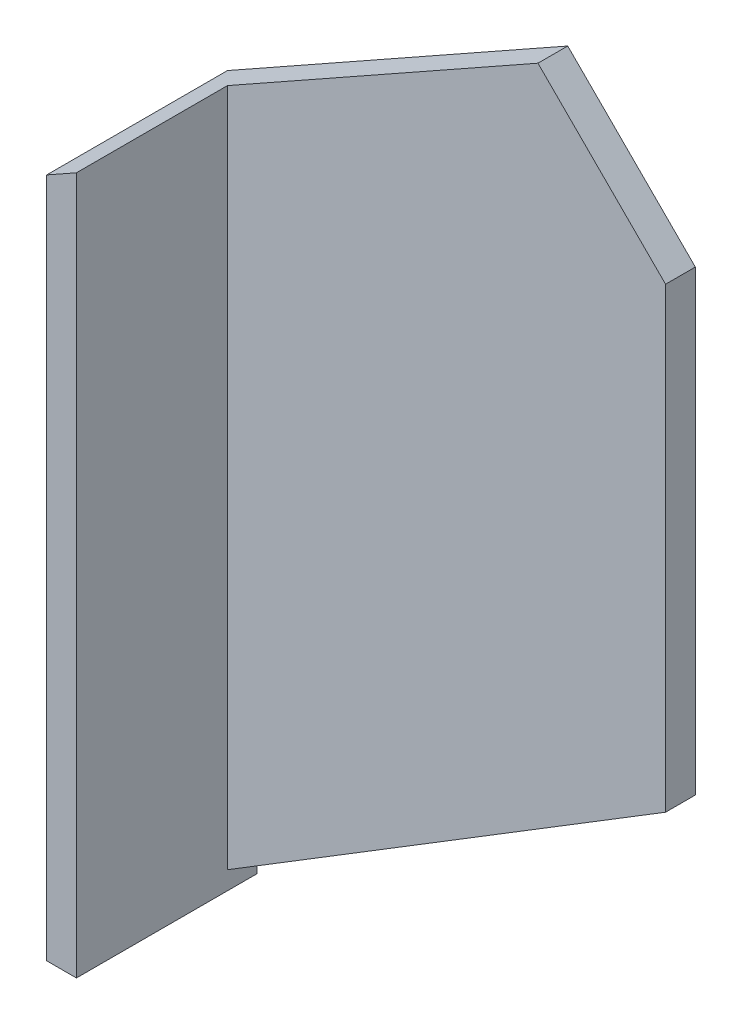
ISO-10303-21;
HEADER;
FILE_DESCRIPTION(('STEP AP214'),'2;1');
FILE_NAME('part.step','',(''),(''),'','','');
FILE_SCHEMA(('AUTOMOTIVE_DESIGN { 1 0 10303 214 1 1 1 1 }'));
ENDSEC;
DATA;
#1=APPLICATION_CONTEXT('core data for automotive mechanical design processes');
#2=APPLICATION_PROTOCOL_DEFINITION('international standard','automotive_design',2000,#1);
#3=PRODUCT_CONTEXT('',#1,'mechanical');
#4=PRODUCT('Part','Part','',(#3));
#5=PRODUCT_RELATED_PRODUCT_CATEGORY('part','',(#4));
#6=PRODUCT_DEFINITION_FORMATION('','',#4);
#7=PRODUCT_DEFINITION_CONTEXT('part definition',#1,'design');
#8=PRODUCT_DEFINITION('design','',#6,#7);
#9=PRODUCT_DEFINITION_SHAPE('','',#8);
#10=(LENGTH_UNIT() NAMED_UNIT(*) SI_UNIT(.MILLI.,.METRE.));
#11=(NAMED_UNIT(*) PLANE_ANGLE_UNIT() SI_UNIT($,.RADIAN.));
#12=(NAMED_UNIT(*) SI_UNIT($,.STERADIAN.) SOLID_ANGLE_UNIT());
#13=UNCERTAINTY_MEASURE_WITH_UNIT(LENGTH_MEASURE(1.E-05),#10,'distance_accuracy_value','');
#14=(GEOMETRIC_REPRESENTATION_CONTEXT(3) GLOBAL_UNCERTAINTY_ASSIGNED_CONTEXT((#13)) GLOBAL_UNIT_ASSIGNED_CONTEXT((#10,
#11,#12)) REPRESENTATION_CONTEXT('',''));
#15=CARTESIAN_POINT('',(0.,0.,0.));
#16=DIRECTION('',(0.,0.,1.));
#17=DIRECTION('',(1.,0.,0.));
#18=AXIS2_PLACEMENT_3D('',#15,#16,#17);
#19=CARTESIAN_POINT('',(-119.656440363729,-63.3766663723846,14.));
#20=DIRECTION('',(-0.52301621985259,0.852322728648666,0.));
#21=DIRECTION('',(-0.852322728648666,-0.52301621985259,0.));
#22=AXIS2_PLACEMENT_3D('',#19,#20,#21);
#23=PLANE('',#22);
#24=DIRECTION('',(0.,0.,1.));
#25=VECTOR('',#24,1.);
#26=CARTESIAN_POINT('',(-105.656440363729,-54.7857572814755,14.));
#27=LINE('',#26,#25);
#28=CARTESIAN_POINT('',(-105.656440363729,-54.7857572814755,0.));
#29=VERTEX_POINT('',#28);
#30=CARTESIAN_POINT('',(-105.656440363729,-54.7857572814754,14.));
#31=VERTEX_POINT('',#30);
#32=EDGE_CURVE('E50',#29,#31,#27,.T.);
#33=ORIENTED_EDGE('',*,*,#32,.F.);
#34=DIRECTION('',(0.852322728648666,0.52301621985259,0.));
#35=VECTOR('',#34,1.);
#36=CARTESIAN_POINT('',(-119.656440363729,-63.3766663723846,0.));
#37=LINE('',#36,#35);
#38=CARTESIAN_POINT('',(100.343559636271,71.6233336276154,0.));
#39=VERTEX_POINT('',#38);
#40=EDGE_CURVE('E106',#29,#39,#37,.T.);
#41=ORIENTED_EDGE('',*,*,#40,.T.);
#42=DIRECTION('',(0.,0.,-1.));
#43=VECTOR('',#42,1.);
#44=CARTESIAN_POINT('',(100.343559636271,71.6233336276154,14.));
#45=LINE('',#44,#43);
#46=CARTESIAN_POINT('',(100.343559636271,71.6233336276154,14.));
#47=VERTEX_POINT('',#46);
#48=EDGE_CURVE('E11',#47,#39,#45,.T.);
#49=ORIENTED_EDGE('',*,*,#48,.F.);
#50=DIRECTION('',(0.852322728648666,0.52301621985259,0.));
#51=VECTOR('',#50,1.);
#52=CARTESIAN_POINT('',(-119.656440363729,-63.3766663723846,14.));
#53=LINE('',#52,#51);
#54=EDGE_CURVE('E164',#31,#47,#53,.T.);
#55=ORIENTED_EDGE('',*,*,#54,.F.);
#56=EDGE_LOOP('',(#33,#41,#49,#55));
#57=FACE_BOUND('',#56,.T.);
#58=ADVANCED_FACE('F34',(#57),#23,.F.);
#59=CARTESIAN_POINT('',(233.582996255987,153.383897007896,14.));
#60=DIRECTION('',(0.,0.,1.));
#61=DIRECTION('',(1.,0.,0.));
#62=AXIS2_PLACEMENT_3D('',#59,#60,#61);
#63=PLANE('',#62);
#64=DIRECTION('',(0.,1.,0.));
#65=VECTOR('',#64,1.);
#66=CARTESIAN_POINT('',(-105.656440363729,264.498333627615,14.));
#67=LINE('',#66,#65);
#68=CARTESIAN_POINT('',(-105.656440363729,264.498333627615,14.));
#69=VERTEX_POINT('',#68);
#70=EDGE_CURVE('E58',#31,#69,#67,.T.);
#71=ORIENTED_EDGE('',*,*,#70,.F.);
#72=ORIENTED_EDGE('',*,*,#54,.T.);
#73=DIRECTION('',(0.,1.,0.));
#74=VECTOR('',#73,1.);
#75=CARTESIAN_POINT('',(100.343559636271,71.6233336276154,14.));
#76=LINE('',#75,#74);
#77=CARTESIAN_POINT('',(100.343559636271,286.623333627615,14.));
#78=VERTEX_POINT('',#77);
#79=EDGE_CURVE('E172',#47,#78,#76,.T.);
#80=ORIENTED_EDGE('',*,*,#79,.T.);
#81=DIRECTION('',(-0.70710678118654,0.707106781186555,0.));
#82=VECTOR('',#81,1.);
#83=CARTESIAN_POINT('',(100.343559636271,286.623333627615,14.));
#84=LINE('',#83,#82);
#85=CARTESIAN_POINT('',(40.3435596362774,346.62333362761,14.));
#86=VERTEX_POINT('',#85);
#87=EDGE_CURVE('E174',#78,#86,#84,.T.);
#88=ORIENTED_EDGE('',*,*,#87,.T.);
#89=DIRECTION('',(-0.87157553712457,-0.490261239632521,0.));
#90=VECTOR('',#89,1.);
#91=CARTESIAN_POINT('',(40.3435596362774,346.62333362761,14.));
#92=LINE('',#91,#90);
#93=EDGE_CURVE('E143',#86,#69,#92,.T.);
#94=ORIENTED_EDGE('',*,*,#93,.T.);
#95=EDGE_LOOP('',(#71,#72,#80,#88,#94));
#96=FACE_BOUND('',#95,.T.);
#97=ADVANCED_FACE('F178',(#96),#63,.T.);
#98=CARTESIAN_POINT('',(233.582996255987,153.383897007896,0.));
#99=DIRECTION('',(0.,0.,1.));
#100=DIRECTION('',(1.,0.,0.));
#101=AXIS2_PLACEMENT_3D('',#98,#99,#100);
#102=PLANE('',#101);
#103=DIRECTION('',(-1.,0.,0.));
#104=VECTOR('',#103,1.);
#105=CARTESIAN_POINT('',(-105.656440363729,-63.3766663723846,0.));
#106=LINE('',#105,#104);
#107=CARTESIAN_POINT('',(-105.656440363729,-63.3766663723846,0.));
#108=VERTEX_POINT('',#107);
#109=CARTESIAN_POINT('',(-119.656440363729,-63.3766663723846,0.));
#110=VERTEX_POINT('',#109);
#111=EDGE_CURVE('E104',#108,#110,#106,.T.);
#112=ORIENTED_EDGE('',*,*,#111,.T.);
#113=DIRECTION('',(0.,-1.,0.));
#114=VECTOR('',#113,1.);
#115=CARTESIAN_POINT('',(-119.656440363729,-63.3766663723846,0.));
#116=LINE('',#115,#114);
#117=CARTESIAN_POINT('',(-119.656440363729,256.623333627615,0.));
#118=VERTEX_POINT('',#117);
#119=EDGE_CURVE('E162',#118,#110,#116,.T.);
#120=ORIENTED_EDGE('',*,*,#119,.F.);
#121=DIRECTION('',(-0.87157553712457,-0.490261239632521,0.));
#122=VECTOR('',#121,1.);
#123=CARTESIAN_POINT('',(40.3435596362774,346.62333362761,0.));
#124=LINE('',#123,#122);
#125=CARTESIAN_POINT('',(40.3435596362774,346.62333362761,0.));
#126=VERTEX_POINT('',#125);
#127=EDGE_CURVE('E159',#126,#118,#124,.T.);
#128=ORIENTED_EDGE('',*,*,#127,.F.);
#129=DIRECTION('',(-0.70710678118654,0.707106781186555,0.));
#130=VECTOR('',#129,1.);
#131=CARTESIAN_POINT('',(100.343559636271,286.623333627615,0.));
#132=LINE('',#131,#130);
#133=CARTESIAN_POINT('',(100.343559636271,286.623333627615,0.));
#134=VERTEX_POINT('',#133);
#135=EDGE_CURVE('E153',#134,#126,#132,.T.);
#136=ORIENTED_EDGE('',*,*,#135,.F.);
#137=DIRECTION('',(0.,1.,0.));
#138=VECTOR('',#137,1.);
#139=CARTESIAN_POINT('',(100.343559636271,71.6233336276154,0.));
#140=LINE('',#139,#138);
#141=EDGE_CURVE('E150',#39,#134,#140,.T.);
#142=ORIENTED_EDGE('',*,*,#141,.F.);
#143=ORIENTED_EDGE('',*,*,#40,.F.);
#144=DIRECTION('',(0.,-1.,0.));
#145=VECTOR('',#144,1.);
#146=CARTESIAN_POINT('',(-105.656440363729,256.623333627615,0.));
#147=LINE('',#146,#145);
#148=EDGE_CURVE('E100',#29,#108,#147,.T.);
#149=ORIENTED_EDGE('',*,*,#148,.T.);
#150=EDGE_LOOP('',(#112,#120,#128,#136,#142,#143,#149));
#151=FACE_BOUND('',#150,.T.);
#152=ADVANCED_FACE('F102',(#151),#102,.F.);
#153=CARTESIAN_POINT('',(100.343559636271,71.6233336276154,14.));
#154=DIRECTION('',(-1.,0.,0.));
#155=DIRECTION('',(0.,0.,1.));
#156=AXIS2_PLACEMENT_3D('',#153,#154,#155);
#157=PLANE('',#156);
#158=ORIENTED_EDGE('',*,*,#141,.T.);
#159=DIRECTION('',(0.,0.,-1.));
#160=VECTOR('',#159,1.);
#161=CARTESIAN_POINT('',(100.343559636271,286.623333627615,14.));
#162=LINE('',#161,#160);
#163=EDGE_CURVE('E42',#78,#134,#162,.T.);
#164=ORIENTED_EDGE('',*,*,#163,.F.);
#165=ORIENTED_EDGE('',*,*,#79,.F.);
#166=ORIENTED_EDGE('',*,*,#48,.T.);
#167=EDGE_LOOP('',(#158,#164,#165,#166));
#168=FACE_BOUND('',#167,.T.);
#169=ADVANCED_FACE('F204',(#168),#157,.F.);
#170=CARTESIAN_POINT('',(100.343559636271,286.623333627615,14.));
#171=DIRECTION('',(-0.707106781186555,-0.70710678118654,0.));
#172=DIRECTION('',(0.70710678118654,-0.707106781186555,0.));
#173=AXIS2_PLACEMENT_3D('',#170,#171,#172);
#174=PLANE('',#173);
#175=ORIENTED_EDGE('',*,*,#135,.T.);
#176=DIRECTION('',(0.,0.,-1.));
#177=VECTOR('',#176,1.);
#178=CARTESIAN_POINT('',(40.3435596362774,346.62333362761,14.));
#179=LINE('',#178,#177);
#180=EDGE_CURVE('E168',#86,#126,#179,.T.);
#181=ORIENTED_EDGE('',*,*,#180,.F.);
#182=ORIENTED_EDGE('',*,*,#87,.F.);
#183=ORIENTED_EDGE('',*,*,#163,.T.);
#184=EDGE_LOOP('',(#175,#181,#182,#183));
#185=FACE_BOUND('',#184,.T.);
#186=ADVANCED_FACE('F211',(#185),#174,.F.);
#187=CARTESIAN_POINT('',(40.3435596362774,346.62333362761,14.));
#188=DIRECTION('',(0.490261239632521,-0.87157553712457,0.));
#189=DIRECTION('',(0.87157553712457,0.490261239632521,0.));
#190=AXIS2_PLACEMENT_3D('',#187,#188,#189);
#191=PLANE('',#190);
#192=ORIENTED_EDGE('',*,*,#127,.T.);
#193=DIRECTION('',(0.,0.,-1.));
#194=VECTOR('',#193,1.);
#195=CARTESIAN_POINT('',(-119.656440363729,256.623333627615,14.));
#196=LINE('',#195,#194);
#197=CARTESIAN_POINT('',(-119.656440363729,256.623333627615,85.));
#198=VERTEX_POINT('',#197);
#199=EDGE_CURVE('E166',#198,#118,#196,.T.);
#200=ORIENTED_EDGE('',*,*,#199,.F.);
#201=DIRECTION('',(-0.871575537124571,-0.490261239632521,0.));
#202=VECTOR('',#201,1.);
#203=CARTESIAN_POINT('',(-105.656440363729,264.498333627615,85.));
#204=LINE('',#203,#202);
#205=CARTESIAN_POINT('',(-105.656440363729,264.498333627615,85.));
#206=VERTEX_POINT('',#205);
#207=EDGE_CURVE('E129',#206,#198,#204,.T.);
#208=ORIENTED_EDGE('',*,*,#207,.F.);
#209=DIRECTION('',(0.,0.,-1.));
#210=VECTOR('',#209,1.);
#211=CARTESIAN_POINT('',(-105.656440363729,264.498333627615,85.));
#212=LINE('',#211,#210);
#213=EDGE_CURVE('E136',#206,#69,#212,.T.);
#214=ORIENTED_EDGE('',*,*,#213,.T.);
#215=ORIENTED_EDGE('',*,*,#93,.F.);
#216=ORIENTED_EDGE('',*,*,#180,.T.);
#217=EDGE_LOOP('',(#192,#200,#208,#214,#215,#216));
#218=FACE_BOUND('',#217,.T.);
#219=ADVANCED_FACE('F179',(#218),#191,.F.);
#220=CARTESIAN_POINT('',(-119.656440363729,-63.3766663723846,14.));
#221=DIRECTION('',(1.,0.,0.));
#222=DIRECTION('',(0.,1.,0.));
#223=AXIS2_PLACEMENT_3D('',#220,#221,#222);
#224=PLANE('',#223);
#225=ORIENTED_EDGE('',*,*,#119,.T.);
#226=DIRECTION('',(0.,0.,-1.));
#227=VECTOR('',#226,1.);
#228=CARTESIAN_POINT('',(-119.656440363729,-63.3766663723846,14.));
#229=LINE('',#228,#227);
#230=CARTESIAN_POINT('',(-119.656440363729,-63.3766663723846,85.));
#231=VERTEX_POINT('',#230);
#232=EDGE_CURVE('E115',#231,#110,#229,.T.);
#233=ORIENTED_EDGE('',*,*,#232,.F.);
#234=DIRECTION('',(0.,-1.,0.));
#235=VECTOR('',#234,1.);
#236=CARTESIAN_POINT('',(-119.656440363729,256.623333627615,85.));
#237=LINE('',#236,#235);
#238=EDGE_CURVE('E132',#198,#231,#237,.T.);
#239=ORIENTED_EDGE('',*,*,#238,.F.);
#240=ORIENTED_EDGE('',*,*,#199,.T.);
#241=EDGE_LOOP('',(#225,#233,#239,#240));
#242=FACE_BOUND('',#241,.T.);
#243=ADVANCED_FACE('F184',(#242),#224,.F.);
#244=CARTESIAN_POINT('',(-105.656440363729,264.498333627615,85.));
#245=DIRECTION('',(-1.,0.,0.));
#246=DIRECTION('',(0.,-1.,0.));
#247=AXIS2_PLACEMENT_3D('',#244,#245,#246);
#248=PLANE('',#247);
#249=ORIENTED_EDGE('',*,*,#213,.F.);
#250=DIRECTION('',(0.,1.,0.));
#251=VECTOR('',#250,1.);
#252=CARTESIAN_POINT('',(-105.656440363729,264.498333627615,85.));
#253=LINE('',#252,#251);
#254=CARTESIAN_POINT('',(-105.656440363729,-63.3766663723846,85.));
#255=VERTEX_POINT('',#254);
#256=EDGE_CURVE('E121',#255,#206,#253,.T.);
#257=ORIENTED_EDGE('',*,*,#256,.F.);
#258=DIRECTION('',(0.,0.,1.));
#259=VECTOR('',#258,1.);
#260=CARTESIAN_POINT('',(-105.656440363729,-63.3766663723846,0.));
#261=LINE('',#260,#259);
#262=EDGE_CURVE('E109',#108,#255,#261,.T.);
#263=ORIENTED_EDGE('',*,*,#262,.F.);
#264=ORIENTED_EDGE('',*,*,#148,.F.);
#265=ORIENTED_EDGE('',*,*,#32,.T.);
#266=ORIENTED_EDGE('',*,*,#70,.T.);
#267=EDGE_LOOP('',(#249,#257,#263,#264,#265,#266));
#268=FACE_BOUND('',#267,.T.);
#269=ADVANCED_FACE('F120',(#268),#248,.F.);
#270=CARTESIAN_POINT('',(-119.656440363729,256.623333627615,85.));
#271=DIRECTION('',(0.,0.,1.));
#272=DIRECTION('',(1.,0.,0.));
#273=AXIS2_PLACEMENT_3D('',#270,#271,#272);
#274=PLANE('',#273);
#275=ORIENTED_EDGE('',*,*,#207,.T.);
#276=ORIENTED_EDGE('',*,*,#238,.T.);
#277=DIRECTION('',(-1.,0.,0.));
#278=VECTOR('',#277,1.);
#279=CARTESIAN_POINT('',(-105.656440363729,-63.3766663723846,85.));
#280=LINE('',#279,#278);
#281=EDGE_CURVE('E117',#255,#231,#280,.T.);
#282=ORIENTED_EDGE('',*,*,#281,.F.);
#283=ORIENTED_EDGE('',*,*,#256,.T.);
#284=EDGE_LOOP('',(#275,#276,#282,#283));
#285=FACE_BOUND('',#284,.T.);
#286=ADVANCED_FACE('F187',(#285),#274,.T.);
#287=CARTESIAN_POINT('',(-105.656440363729,-63.3766663723846,0.));
#288=DIRECTION('',(0.,-1.,0.));
#289=DIRECTION('',(1.,0.,0.));
#290=AXIS2_PLACEMENT_3D('',#287,#288,#289);
#291=PLANE('',#290);
#292=ORIENTED_EDGE('',*,*,#232,.T.);
#293=ORIENTED_EDGE('',*,*,#111,.F.);
#294=ORIENTED_EDGE('',*,*,#262,.T.);
#295=ORIENTED_EDGE('',*,*,#281,.T.);
#296=EDGE_LOOP('',(#292,#293,#294,#295));
#297=FACE_BOUND('',#296,.T.);
#298=ADVANCED_FACE('F113',(#297),#291,.T.);
#299=CLOSED_SHELL('',(#58,#97,#152,#169,#186,#219,#243,#269,#286,#298));
#300=MANIFOLD_SOLID_BREP('B2',#299);
#301=ADVANCED_BREP_SHAPE_REPRESENTATION('',(#18,#300),#14);
#302=SHAPE_DEFINITION_REPRESENTATION(#9,#301);
ENDSEC;
END-ISO-10303-21;
